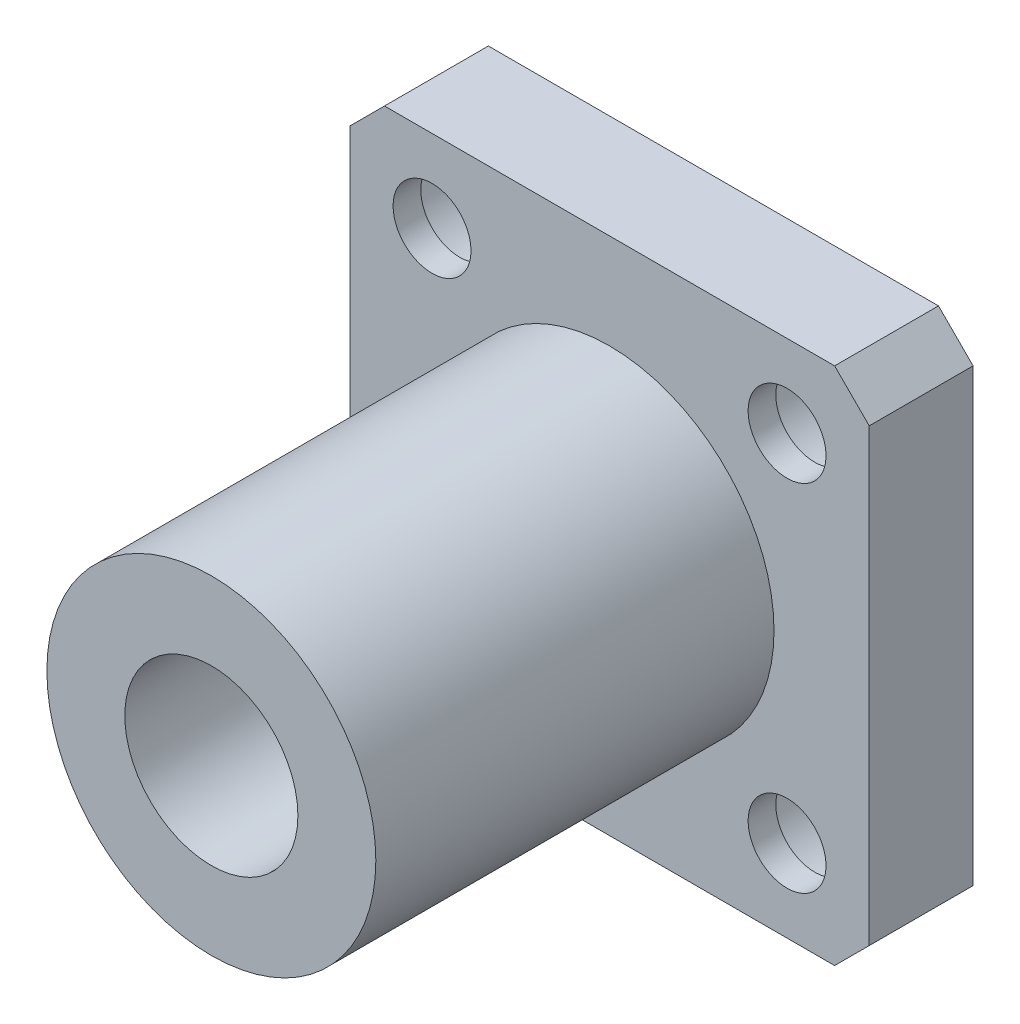
ISO-10303-21;
HEADER;
FILE_DESCRIPTION(('STEP AP214'),'2;1');
FILE_NAME('part.step','',(''),(''),'','','');
FILE_SCHEMA(('AUTOMOTIVE_DESIGN { 1 0 10303 214 1 1 1 1 }'));
ENDSEC;
DATA;
#1=APPLICATION_CONTEXT('core data for automotive mechanical design processes');
#2=APPLICATION_PROTOCOL_DEFINITION('international standard','automotive_design',2000,#1);
#3=PRODUCT_CONTEXT('',#1,'mechanical');
#4=PRODUCT('Part','Part','',(#3));
#5=PRODUCT_RELATED_PRODUCT_CATEGORY('part','',(#4));
#6=PRODUCT_DEFINITION_FORMATION('','',#4);
#7=PRODUCT_DEFINITION_CONTEXT('part definition',#1,'design');
#8=PRODUCT_DEFINITION('design','',#6,#7);
#9=PRODUCT_DEFINITION_SHAPE('','',#8);
#10=(LENGTH_UNIT() NAMED_UNIT(*) SI_UNIT(.MILLI.,.METRE.));
#11=(NAMED_UNIT(*) PLANE_ANGLE_UNIT() SI_UNIT($,.RADIAN.));
#12=(NAMED_UNIT(*) SI_UNIT($,.STERADIAN.) SOLID_ANGLE_UNIT());
#13=UNCERTAINTY_MEASURE_WITH_UNIT(LENGTH_MEASURE(1.E-05),#10,'distance_accuracy_value','');
#14=(GEOMETRIC_REPRESENTATION_CONTEXT(3) GLOBAL_UNCERTAINTY_ASSIGNED_CONTEXT((#13)) GLOBAL_UNIT_ASSIGNED_CONTEXT((#10,
#11,#12)) REPRESENTATION_CONTEXT('',''));
#15=CARTESIAN_POINT('',(0.,0.,0.));
#16=DIRECTION('',(0.,0.,1.));
#17=DIRECTION('',(1.,0.,0.));
#18=AXIS2_PLACEMENT_3D('',#15,#16,#17);
#19=CARTESIAN_POINT('',(0.,0.,6.));
#20=DIRECTION('',(1.,0.,0.));
#21=DIRECTION('',(0.,0.,-1.));
#22=AXIS2_PLACEMENT_3D('',#19,#20,#21);
#23=PLANE('',#22);
#24=DIRECTION('',(0.,-1.,0.));
#25=VECTOR('',#24,1.);
#26=CARTESIAN_POINT('',(0.,0.,6.));
#27=LINE('',#26,#25);
#28=CARTESIAN_POINT('',(0.,28.,6.));
#29=VERTEX_POINT('',#28);
#30=CARTESIAN_POINT('',(0.,2.00000000000001,6.));
#31=VERTEX_POINT('',#30);
#32=EDGE_CURVE('E121',#29,#31,#27,.T.);
#33=ORIENTED_EDGE('',*,*,#32,.F.);
#34=DIRECTION('',(0.,0.,-1.));
#35=VECTOR('',#34,1.);
#36=CARTESIAN_POINT('',(0.,28.,6.));
#37=LINE('',#36,#35);
#38=CARTESIAN_POINT('',(0.,28.,0.));
#39=VERTEX_POINT('',#38);
#40=EDGE_CURVE('E106',#29,#39,#37,.T.);
#41=ORIENTED_EDGE('',*,*,#40,.T.);
#42=DIRECTION('',(0.,-1.,0.));
#43=VECTOR('',#42,1.);
#44=CARTESIAN_POINT('',(0.,0.,0.));
#45=LINE('',#44,#43);
#46=CARTESIAN_POINT('',(0.,2.00000000000001,0.));
#47=VERTEX_POINT('',#46);
#48=EDGE_CURVE('E118',#39,#47,#45,.T.);
#49=ORIENTED_EDGE('',*,*,#48,.T.);
#50=DIRECTION('',(0.,0.,1.));
#51=VECTOR('',#50,1.);
#52=CARTESIAN_POINT('',(0.,2.00000000000001,6.));
#53=LINE('',#52,#51);
#54=EDGE_CURVE('E123',#47,#31,#53,.T.);
#55=ORIENTED_EDGE('',*,*,#54,.T.);
#56=EDGE_LOOP('',(#33,#41,#49,#55));
#57=FACE_BOUND('',#56,.T.);
#58=ADVANCED_FACE('F35',(#57),#23,.F.);
#59=CARTESIAN_POINT('',(0.,0.,6.));
#60=DIRECTION('',(0.,1.,0.));
#61=DIRECTION('',(0.,0.,1.));
#62=AXIS2_PLACEMENT_3D('',#59,#60,#61);
#63=PLANE('',#62);
#64=DIRECTION('',(1.,0.,0.));
#65=VECTOR('',#64,1.);
#66=CARTESIAN_POINT('',(0.,0.,0.));
#67=LINE('',#66,#65);
#68=CARTESIAN_POINT('',(2.,0.,0.));
#69=VERTEX_POINT('',#68);
#70=CARTESIAN_POINT('',(28.,0.,0.));
#71=VERTEX_POINT('',#70);
#72=EDGE_CURVE('E127',#69,#71,#67,.T.);
#73=ORIENTED_EDGE('',*,*,#72,.T.);
#74=DIRECTION('',(0.,0.,1.));
#75=VECTOR('',#74,1.);
#76=CARTESIAN_POINT('',(28.,0.,6.));
#77=LINE('',#76,#75);
#78=CARTESIAN_POINT('',(28.,0.,6.));
#79=VERTEX_POINT('',#78);
#80=EDGE_CURVE('E11',#71,#79,#77,.T.);
#81=ORIENTED_EDGE('',*,*,#80,.T.);
#82=DIRECTION('',(1.,0.,0.));
#83=VECTOR('',#82,1.);
#84=CARTESIAN_POINT('',(0.,0.,6.));
#85=LINE('',#84,#83);
#86=CARTESIAN_POINT('',(2.,0.,6.));
#87=VERTEX_POINT('',#86);
#88=EDGE_CURVE('E188',#87,#79,#85,.T.);
#89=ORIENTED_EDGE('',*,*,#88,.F.);
#90=DIRECTION('',(0.,0.,-1.));
#91=VECTOR('',#90,1.);
#92=CARTESIAN_POINT('',(2.,0.,6.));
#93=LINE('',#92,#91);
#94=EDGE_CURVE('E44',#87,#69,#93,.T.);
#95=ORIENTED_EDGE('',*,*,#94,.T.);
#96=EDGE_LOOP('',(#73,#81,#89,#95));
#97=FACE_BOUND('',#96,.T.);
#98=ADVANCED_FACE('F186',(#97),#63,.F.);
#99=CARTESIAN_POINT('',(30.,0.,6.));
#100=DIRECTION('',(-1.,0.,0.));
#101=DIRECTION('',(0.,0.,1.));
#102=AXIS2_PLACEMENT_3D('',#99,#100,#101);
#103=PLANE('',#102);
#104=DIRECTION('',(0.,1.,0.));
#105=VECTOR('',#104,1.);
#106=CARTESIAN_POINT('',(30.,0.,0.));
#107=LINE('',#106,#105);
#108=CARTESIAN_POINT('',(30.,2.,0.));
#109=VERTEX_POINT('',#108);
#110=CARTESIAN_POINT('',(30.,28.,0.));
#111=VERTEX_POINT('',#110);
#112=EDGE_CURVE('E131',#109,#111,#107,.T.);
#113=ORIENTED_EDGE('',*,*,#112,.T.);
#114=DIRECTION('',(0.,0.,1.));
#115=VECTOR('',#114,1.);
#116=CARTESIAN_POINT('',(30.,28.,6.));
#117=LINE('',#116,#115);
#118=CARTESIAN_POINT('',(30.,28.,6.));
#119=VERTEX_POINT('',#118);
#120=EDGE_CURVE('E51',#111,#119,#117,.T.);
#121=ORIENTED_EDGE('',*,*,#120,.T.);
#122=DIRECTION('',(0.,1.,0.));
#123=VECTOR('',#122,1.);
#124=CARTESIAN_POINT('',(30.,0.,6.));
#125=LINE('',#124,#123);
#126=CARTESIAN_POINT('',(30.,2.,6.));
#127=VERTEX_POINT('',#126);
#128=EDGE_CURVE('E196',#127,#119,#125,.T.);
#129=ORIENTED_EDGE('',*,*,#128,.F.);
#130=DIRECTION('',(0.,0.,-1.));
#131=VECTOR('',#130,1.);
#132=CARTESIAN_POINT('',(30.,2.,6.));
#133=LINE('',#132,#131);
#134=EDGE_CURVE('E179',#127,#109,#133,.T.);
#135=ORIENTED_EDGE('',*,*,#134,.T.);
#136=EDGE_LOOP('',(#113,#121,#129,#135));
#137=FACE_BOUND('',#136,.T.);
#138=ADVANCED_FACE('F195',(#137),#103,.F.);
#139=CARTESIAN_POINT('',(0.,30.,6.));
#140=DIRECTION('',(0.,-1.,0.));
#141=DIRECTION('',(0.,0.,-1.));
#142=AXIS2_PLACEMENT_3D('',#139,#140,#141);
#143=PLANE('',#142);
#144=DIRECTION('',(-1.,0.,0.));
#145=VECTOR('',#144,1.);
#146=CARTESIAN_POINT('',(0.,30.,0.));
#147=LINE('',#146,#145);
#148=CARTESIAN_POINT('',(28.,30.,0.));
#149=VERTEX_POINT('',#148);
#150=CARTESIAN_POINT('',(2.00000000000001,30.,0.));
#151=VERTEX_POINT('',#150);
#152=EDGE_CURVE('E141',#149,#151,#147,.T.);
#153=ORIENTED_EDGE('',*,*,#152,.T.);
#154=DIRECTION('',(0.,0.,1.));
#155=VECTOR('',#154,1.);
#156=CARTESIAN_POINT('',(2.00000000000001,30.,6.));
#157=LINE('',#156,#155);
#158=CARTESIAN_POINT('',(2.00000000000001,30.,6.));
#159=VERTEX_POINT('',#158);
#160=EDGE_CURVE('E107',#151,#159,#157,.T.);
#161=ORIENTED_EDGE('',*,*,#160,.T.);
#162=DIRECTION('',(-1.,0.,0.));
#163=VECTOR('',#162,1.);
#164=CARTESIAN_POINT('',(0.,30.,6.));
#165=LINE('',#164,#163);
#166=CARTESIAN_POINT('',(28.,30.,6.));
#167=VERTEX_POINT('',#166);
#168=EDGE_CURVE('E137',#167,#159,#165,.T.);
#169=ORIENTED_EDGE('',*,*,#168,.F.);
#170=DIRECTION('',(0.,0.,-1.));
#171=VECTOR('',#170,1.);
#172=CARTESIAN_POINT('',(28.,30.,6.));
#173=LINE('',#172,#171);
#174=EDGE_CURVE('E112',#167,#149,#173,.T.);
#175=ORIENTED_EDGE('',*,*,#174,.T.);
#176=EDGE_LOOP('',(#153,#161,#169,#175));
#177=FACE_BOUND('',#176,.T.);
#178=ADVANCED_FACE('F272',(#177),#143,.F.);
#179=CARTESIAN_POINT('',(0.,0.,6.));
#180=DIRECTION('',(0.,0.,-1.));
#181=DIRECTION('',(-1.,0.,0.));
#182=AXIS2_PLACEMENT_3D('',#179,#180,#181);
#183=PLANE('',#182);
#184=CARTESIAN_POINT('',(25.2530483272049,25.2530483272049,6.));
#185=DIRECTION('',(0.,0.,-1.));
#186=DIRECTION('',(-1.,0.,0.));
#187=AXIS2_PLACEMENT_3D('',#184,#185,#186);
#188=CIRCLE('',#187,2.25);
#189=CARTESIAN_POINT('',(23.0030483272049,25.2530483272049,6.));
#190=VERTEX_POINT('',#189);
#191=EDGE_CURVE('E158',#190,#190,#188,.T.);
#192=ORIENTED_EDGE('',*,*,#191,.T.);
#193=EDGE_LOOP('',(#192));
#194=FACE_BOUND('',#193,.T.);
#195=CARTESIAN_POINT('',(4.74695167279503,25.2530483272049,6.));
#196=DIRECTION('',(0.,0.,-1.));
#197=DIRECTION('',(-1.,0.,0.));
#198=AXIS2_PLACEMENT_3D('',#195,#196,#197);
#199=CIRCLE('',#198,2.25);
#200=CARTESIAN_POINT('',(2.49695167279503,25.2530483272049,6.));
#201=VERTEX_POINT('',#200);
#202=EDGE_CURVE('E153',#201,#201,#199,.T.);
#203=ORIENTED_EDGE('',*,*,#202,.T.);
#204=EDGE_LOOP('',(#203));
#205=FACE_BOUND('',#204,.T.);
#206=CARTESIAN_POINT('',(4.74695167279514,4.74695167279499,6.));
#207=DIRECTION('',(0.,0.,-1.));
#208=DIRECTION('',(-1.,0.,0.));
#209=AXIS2_PLACEMENT_3D('',#206,#207,#208);
#210=CIRCLE('',#209,2.25);
#211=CARTESIAN_POINT('',(2.49695167279514,4.74695167279499,6.));
#212=VERTEX_POINT('',#211);
#213=EDGE_CURVE('E148',#212,#212,#210,.T.);
#214=ORIENTED_EDGE('',*,*,#213,.T.);
#215=EDGE_LOOP('',(#214));
#216=FACE_BOUND('',#215,.T.);
#217=CARTESIAN_POINT('',(25.253048327205,4.74695167279517,6.));
#218=DIRECTION('',(0.,0.,-1.));
#219=DIRECTION('',(-1.,0.,0.));
#220=AXIS2_PLACEMENT_3D('',#217,#218,#219);
#221=CIRCLE('',#220,2.25);
#222=CARTESIAN_POINT('',(23.0030483272051,4.74695167279517,6.));
#223=VERTEX_POINT('',#222);
#224=EDGE_CURVE('E143',#223,#223,#221,.T.);
#225=ORIENTED_EDGE('',*,*,#224,.T.);
#226=EDGE_LOOP('',(#225));
#227=FACE_BOUND('',#226,.T.);
#228=CARTESIAN_POINT('',(15.,15.,6.));
#229=DIRECTION('',(0.,0.,1.));
#230=DIRECTION('',(1.,0.,0.));
#231=AXIS2_PLACEMENT_3D('',#228,#229,#230);
#232=CIRCLE('',#231,9.5);
#233=CARTESIAN_POINT('',(24.5,15.,6.));
#234=VERTEX_POINT('',#233);
#235=EDGE_CURVE('E163',#234,#234,#232,.T.);
#236=ORIENTED_EDGE('',*,*,#235,.F.);
#237=EDGE_LOOP('',(#236));
#238=FACE_BOUND('',#237,.T.);
#239=ORIENTED_EDGE('',*,*,#168,.T.);
#240=DIRECTION('',(0.707106781186549,0.707106781186546,0.));
#241=VECTOR('',#240,1.);
#242=CARTESIAN_POINT('',(0.,28.,6.));
#243=LINE('',#242,#241);
#244=EDGE_CURVE('E177',#159,#29,#243,.F.);
#245=ORIENTED_EDGE('',*,*,#244,.T.);
#246=ORIENTED_EDGE('',*,*,#32,.T.);
#247=DIRECTION('',(-0.707106781186546,0.707106781186549,0.));
#248=VECTOR('',#247,1.);
#249=CARTESIAN_POINT('',(2.,0.,6.));
#250=LINE('',#249,#248);
#251=EDGE_CURVE('E172',#31,#87,#250,.F.);
#252=ORIENTED_EDGE('',*,*,#251,.T.);
#253=ORIENTED_EDGE('',*,*,#88,.T.);
#254=DIRECTION('',(-0.707106781186549,-0.707106781186546,0.));
#255=VECTOR('',#254,1.);
#256=CARTESIAN_POINT('',(30.,2.,6.));
#257=LINE('',#256,#255);
#258=EDGE_CURVE('E58',#79,#127,#257,.F.);
#259=ORIENTED_EDGE('',*,*,#258,.T.);
#260=ORIENTED_EDGE('',*,*,#128,.T.);
#261=DIRECTION('',(0.707106781186546,-0.707106781186549,0.));
#262=VECTOR('',#261,1.);
#263=CARTESIAN_POINT('',(28.,30.,6.));
#264=LINE('',#263,#262);
#265=EDGE_CURVE('E175',#119,#167,#264,.F.);
#266=ORIENTED_EDGE('',*,*,#265,.T.);
#267=EDGE_LOOP('',(#239,#245,#246,#252,#253,#259,#260,#266));
#268=FACE_BOUND('',#267,.T.);
#269=ADVANCED_FACE('F243',(#194,#205,#216,#227,#238,#268),#183,.F.);
#270=CARTESIAN_POINT('',(0.,0.,0.));
#271=DIRECTION('',(0.,0.,-1.));
#272=DIRECTION('',(-1.,0.,0.));
#273=AXIS2_PLACEMENT_3D('',#270,#271,#272);
#274=PLANE('',#273);
#275=CARTESIAN_POINT('',(25.2530483272049,25.2530483272049,0.));
#276=DIRECTION('',(0.,0.,-1.));
#277=DIRECTION('',(-1.,0.,0.));
#278=AXIS2_PLACEMENT_3D('',#275,#276,#277);
#279=CIRCLE('',#278,4.);
#280=CARTESIAN_POINT('',(21.2530483272049,25.2530483272049,0.));
#281=VERTEX_POINT('',#280);
#282=EDGE_CURVE('E234',#281,#281,#279,.T.);
#283=ORIENTED_EDGE('',*,*,#282,.F.);
#284=EDGE_LOOP('',(#283));
#285=FACE_BOUND('',#284,.T.);
#286=CARTESIAN_POINT('',(4.74695167279503,25.2530483272049,0.));
#287=DIRECTION('',(0.,0.,-1.));
#288=DIRECTION('',(-1.,0.,0.));
#289=AXIS2_PLACEMENT_3D('',#286,#287,#288);
#290=CIRCLE('',#289,4.);
#291=CARTESIAN_POINT('',(0.746951672795032,25.2530483272049,0.));
#292=VERTEX_POINT('',#291);
#293=EDGE_CURVE('E161',#292,#292,#290,.T.);
#294=ORIENTED_EDGE('',*,*,#293,.F.);
#295=EDGE_LOOP('',(#294));
#296=FACE_BOUND('',#295,.T.);
#297=CARTESIAN_POINT('',(4.74695167279514,4.74695167279499,0.));
#298=DIRECTION('',(0.,0.,-1.));
#299=DIRECTION('',(-1.,0.,0.));
#300=AXIS2_PLACEMENT_3D('',#297,#298,#299);
#301=CIRCLE('',#300,4.);
#302=CARTESIAN_POINT('',(0.74695167279514,4.74695167279499,0.));
#303=VERTEX_POINT('',#302);
#304=EDGE_CURVE('E156',#303,#303,#301,.T.);
#305=ORIENTED_EDGE('',*,*,#304,.F.);
#306=EDGE_LOOP('',(#305));
#307=FACE_BOUND('',#306,.T.);
#308=CARTESIAN_POINT('',(25.253048327205,4.74695167279517,0.));
#309=DIRECTION('',(0.,0.,-1.));
#310=DIRECTION('',(-1.,0.,0.));
#311=AXIS2_PLACEMENT_3D('',#308,#309,#310);
#312=CIRCLE('',#311,4.);
#313=CARTESIAN_POINT('',(21.2530483272051,4.74695167279517,0.));
#314=VERTEX_POINT('',#313);
#315=EDGE_CURVE('E151',#314,#314,#312,.T.);
#316=ORIENTED_EDGE('',*,*,#315,.F.);
#317=EDGE_LOOP('',(#316));
#318=FACE_BOUND('',#317,.T.);
#319=CARTESIAN_POINT('',(15.,15.,0.));
#320=DIRECTION('',(0.,0.,1.));
#321=DIRECTION('',(1.,0.,0.));
#322=AXIS2_PLACEMENT_3D('',#319,#320,#321);
#323=CIRCLE('',#322,5.);
#324=CARTESIAN_POINT('',(20.,15.,0.));
#325=VERTEX_POINT('',#324);
#326=EDGE_CURVE('E134',#325,#325,#323,.T.);
#327=ORIENTED_EDGE('',*,*,#326,.T.);
#328=EDGE_LOOP('',(#327));
#329=FACE_BOUND('',#328,.T.);
#330=ORIENTED_EDGE('',*,*,#48,.F.);
#331=DIRECTION('',(-0.707106781186549,-0.707106781186546,0.));
#332=VECTOR('',#331,1.);
#333=CARTESIAN_POINT('',(-14.,14.,0.));
#334=LINE('',#333,#332);
#335=EDGE_CURVE('E102',#39,#151,#334,.F.);
#336=ORIENTED_EDGE('',*,*,#335,.T.);
#337=ORIENTED_EDGE('',*,*,#152,.F.);
#338=DIRECTION('',(-0.707106781186546,0.707106781186549,0.));
#339=VECTOR('',#338,1.);
#340=CARTESIAN_POINT('',(29.,28.9999999999999,0.));
#341=LINE('',#340,#339);
#342=EDGE_CURVE('E113',#149,#111,#341,.F.);
#343=ORIENTED_EDGE('',*,*,#342,.T.);
#344=ORIENTED_EDGE('',*,*,#112,.F.);
#345=DIRECTION('',(0.707106781186549,0.707106781186546,0.));
#346=VECTOR('',#345,1.);
#347=CARTESIAN_POINT('',(13.9999999999999,-14.,0.));
#348=LINE('',#347,#346);
#349=EDGE_CURVE('E166',#109,#71,#348,.F.);
#350=ORIENTED_EDGE('',*,*,#349,.T.);
#351=ORIENTED_EDGE('',*,*,#72,.F.);
#352=DIRECTION('',(0.707106781186546,-0.707106781186549,0.));
#353=VECTOR('',#352,1.);
#354=CARTESIAN_POINT('',(1.,1.,0.));
#355=LINE('',#354,#353);
#356=EDGE_CURVE('E122',#69,#47,#355,.F.);
#357=ORIENTED_EDGE('',*,*,#356,.T.);
#358=EDGE_LOOP('',(#330,#336,#337,#343,#344,#350,#351,#357));
#359=FACE_BOUND('',#358,.T.);
#360=ADVANCED_FACE('F125',(#285,#296,#307,#318,#329,#359),#274,.T.);
#361=CARTESIAN_POINT('',(15.,15.,29.));
#362=DIRECTION('',(0.,0.,-1.));
#363=DIRECTION('',(-1.,0.,0.));
#364=AXIS2_PLACEMENT_3D('',#361,#362,#363);
#365=CYLINDRICAL_SURFACE('',#364,9.5);
#366=CARTESIAN_POINT('',(15.,15.,29.));
#367=DIRECTION('',(0.,0.,1.));
#368=DIRECTION('',(1.,0.,0.));
#369=AXIS2_PLACEMENT_3D('',#366,#367,#368);
#370=CIRCLE('',#369,9.5);
#371=CARTESIAN_POINT('',(24.5,15.,29.));
#372=VERTEX_POINT('',#371);
#373=EDGE_CURVE('E128',#372,#372,#370,.T.);
#374=ORIENTED_EDGE('',*,*,#373,.F.);
#375=EDGE_LOOP('',(#374));
#376=FACE_BOUND('',#375,.T.);
#377=ORIENTED_EDGE('',*,*,#235,.T.);
#378=EDGE_LOOP('',(#377));
#379=FACE_BOUND('',#378,.T.);
#380=ADVANCED_FACE('F242',(#376,#379),#365,.T.);
#381=CARTESIAN_POINT('',(15.,15.,29.));
#382=DIRECTION('',(0.,0.,1.));
#383=DIRECTION('',(1.,0.,0.));
#384=AXIS2_PLACEMENT_3D('',#381,#382,#383);
#385=PLANE('',#384);
#386=CARTESIAN_POINT('',(15.,15.,29.));
#387=DIRECTION('',(0.,0.,1.));
#388=DIRECTION('',(1.,0.,0.));
#389=AXIS2_PLACEMENT_3D('',#386,#387,#388);
#390=CIRCLE('',#389,5.);
#391=CARTESIAN_POINT('',(20.,15.,29.));
#392=VERTEX_POINT('',#391);
#393=EDGE_CURVE('E146',#392,#392,#390,.T.);
#394=ORIENTED_EDGE('',*,*,#393,.F.);
#395=EDGE_LOOP('',(#394));
#396=FACE_BOUND('',#395,.T.);
#397=ORIENTED_EDGE('',*,*,#373,.T.);
#398=EDGE_LOOP('',(#397));
#399=FACE_BOUND('',#398,.T.);
#400=ADVANCED_FACE('F257',(#396,#399),#385,.T.);
#401=CARTESIAN_POINT('',(15.,15.,0.));
#402=DIRECTION('',(0.,0.,1.));
#403=DIRECTION('',(1.,0.,0.));
#404=AXIS2_PLACEMENT_3D('',#401,#402,#403);
#405=CYLINDRICAL_SURFACE('',#404,5.);
#406=ORIENTED_EDGE('',*,*,#326,.F.);
#407=EDGE_LOOP('',(#406));
#408=FACE_BOUND('',#407,.T.);
#409=ORIENTED_EDGE('',*,*,#393,.T.);
#410=EDGE_LOOP('',(#409));
#411=FACE_BOUND('',#410,.T.);
#412=ADVANCED_FACE('F253',(#408,#411),#405,.F.);
#413=CARTESIAN_POINT('',(25.253048327205,4.74695167279517,0.));
#414=DIRECTION('',(0.,0.,-1.));
#415=DIRECTION('',(-1.,0.,0.));
#416=AXIS2_PLACEMENT_3D('',#413,#414,#415);
#417=CYLINDRICAL_SURFACE('',#416,2.25);
#418=CARTESIAN_POINT('',(25.253048327205,4.74695167279517,4.4));
#419=DIRECTION('',(0.,0.,-1.));
#420=DIRECTION('',(-1.,0.,0.));
#421=AXIS2_PLACEMENT_3D('',#418,#419,#420);
#422=CIRCLE('',#421,2.25);
#423=CARTESIAN_POINT('',(23.003048327205,4.74695167279517,4.4));
#424=VERTEX_POINT('',#423);
#425=EDGE_CURVE('E147',#424,#424,#422,.T.);
#426=ORIENTED_EDGE('',*,*,#425,.T.);
#427=EDGE_LOOP('',(#426));
#428=FACE_BOUND('',#427,.T.);
#429=ORIENTED_EDGE('',*,*,#224,.F.);
#430=EDGE_LOOP('',(#429));
#431=FACE_BOUND('',#430,.T.);
#432=ADVANCED_FACE('F256',(#428,#431),#417,.F.);
#433=CARTESIAN_POINT('',(27.5030483272051,4.74695167279517,4.4));
#434=DIRECTION('',(0.,0.,1.));
#435=DIRECTION('',(1.,0.,0.));
#436=AXIS2_PLACEMENT_3D('',#433,#434,#435);
#437=PLANE('',#436);
#438=ORIENTED_EDGE('',*,*,#425,.F.);
#439=EDGE_LOOP('',(#438));
#440=FACE_BOUND('',#439,.T.);
#441=CARTESIAN_POINT('',(25.253048327205,4.74695167279517,4.4));
#442=DIRECTION('',(0.,0.,-1.));
#443=DIRECTION('',(-1.,0.,0.));
#444=AXIS2_PLACEMENT_3D('',#441,#442,#443);
#445=CIRCLE('',#444,4.);
#446=CARTESIAN_POINT('',(21.253048327205,4.74695167279517,4.4));
#447=VERTEX_POINT('',#446);
#448=EDGE_CURVE('E210',#447,#447,#445,.T.);
#449=ORIENTED_EDGE('',*,*,#448,.T.);
#450=EDGE_LOOP('',(#449));
#451=FACE_BOUND('',#450,.T.);
#452=ADVANCED_FACE('F311',(#440,#451),#437,.F.);
#453=CARTESIAN_POINT('',(25.253048327205,4.74695167279517,0.));
#454=DIRECTION('',(0.,0.,-1.));
#455=DIRECTION('',(-1.,0.,0.));
#456=AXIS2_PLACEMENT_3D('',#453,#454,#455);
#457=CYLINDRICAL_SURFACE('',#456,4.);
#458=ORIENTED_EDGE('',*,*,#448,.F.);
#459=EDGE_LOOP('',(#458));
#460=FACE_BOUND('',#459,.T.);
#461=ORIENTED_EDGE('',*,*,#315,.T.);
#462=EDGE_LOOP('',(#461));
#463=FACE_BOUND('',#462,.T.);
#464=ADVANCED_FACE('F315',(#460,#463),#457,.F.);
#465=CARTESIAN_POINT('',(4.74695167279514,4.74695167279499,0.));
#466=DIRECTION('',(0.,0.,-1.));
#467=DIRECTION('',(-1.,0.,0.));
#468=AXIS2_PLACEMENT_3D('',#465,#466,#467);
#469=CYLINDRICAL_SURFACE('',#468,2.25);
#470=CARTESIAN_POINT('',(4.74695167279514,4.74695167279499,4.4));
#471=DIRECTION('',(0.,0.,-1.));
#472=DIRECTION('',(-1.,0.,0.));
#473=AXIS2_PLACEMENT_3D('',#470,#471,#472);
#474=CIRCLE('',#473,2.25);
#475=CARTESIAN_POINT('',(2.49695167279514,4.74695167279499,4.4));
#476=VERTEX_POINT('',#475);
#477=EDGE_CURVE('E152',#476,#476,#474,.T.);
#478=ORIENTED_EDGE('',*,*,#477,.T.);
#479=EDGE_LOOP('',(#478));
#480=FACE_BOUND('',#479,.T.);
#481=ORIENTED_EDGE('',*,*,#213,.F.);
#482=EDGE_LOOP('',(#481));
#483=FACE_BOUND('',#482,.T.);
#484=ADVANCED_FACE('F319',(#480,#483),#469,.F.);
#485=CARTESIAN_POINT('',(6.99695167279514,4.74695167279499,4.4));
#486=DIRECTION('',(0.,0.,1.));
#487=DIRECTION('',(1.,0.,0.));
#488=AXIS2_PLACEMENT_3D('',#485,#486,#487);
#489=PLANE('',#488);
#490=ORIENTED_EDGE('',*,*,#477,.F.);
#491=EDGE_LOOP('',(#490));
#492=FACE_BOUND('',#491,.T.);
#493=CARTESIAN_POINT('',(4.74695167279514,4.74695167279499,4.4));
#494=DIRECTION('',(0.,0.,-1.));
#495=DIRECTION('',(-1.,0.,0.));
#496=AXIS2_PLACEMENT_3D('',#493,#494,#495);
#497=CIRCLE('',#496,4.);
#498=CARTESIAN_POINT('',(0.746951672795138,4.74695167279499,4.4));
#499=VERTEX_POINT('',#498);
#500=EDGE_CURVE('E217',#499,#499,#497,.T.);
#501=ORIENTED_EDGE('',*,*,#500,.T.);
#502=EDGE_LOOP('',(#501));
#503=FACE_BOUND('',#502,.T.);
#504=ADVANCED_FACE('F323',(#492,#503),#489,.F.);
#505=CARTESIAN_POINT('',(4.74695167279514,4.74695167279499,0.));
#506=DIRECTION('',(0.,0.,-1.));
#507=DIRECTION('',(-1.,0.,0.));
#508=AXIS2_PLACEMENT_3D('',#505,#506,#507);
#509=CYLINDRICAL_SURFACE('',#508,4.);
#510=ORIENTED_EDGE('',*,*,#500,.F.);
#511=EDGE_LOOP('',(#510));
#512=FACE_BOUND('',#511,.T.);
#513=ORIENTED_EDGE('',*,*,#304,.T.);
#514=EDGE_LOOP('',(#513));
#515=FACE_BOUND('',#514,.T.);
#516=ADVANCED_FACE('F327',(#512,#515),#509,.F.);
#517=CARTESIAN_POINT('',(4.74695167279503,25.2530483272049,0.));
#518=DIRECTION('',(0.,0.,-1.));
#519=DIRECTION('',(-1.,0.,0.));
#520=AXIS2_PLACEMENT_3D('',#517,#518,#519);
#521=CYLINDRICAL_SURFACE('',#520,2.25);
#522=CARTESIAN_POINT('',(4.74695167279503,25.2530483272049,4.4));
#523=DIRECTION('',(0.,0.,-1.));
#524=DIRECTION('',(-1.,0.,0.));
#525=AXIS2_PLACEMENT_3D('',#522,#523,#524);
#526=CIRCLE('',#525,2.25);
#527=CARTESIAN_POINT('',(2.49695167279503,25.2530483272049,4.4));
#528=VERTEX_POINT('',#527);
#529=EDGE_CURVE('E157',#528,#528,#526,.T.);
#530=ORIENTED_EDGE('',*,*,#529,.T.);
#531=EDGE_LOOP('',(#530));
#532=FACE_BOUND('',#531,.T.);
#533=ORIENTED_EDGE('',*,*,#202,.F.);
#534=EDGE_LOOP('',(#533));
#535=FACE_BOUND('',#534,.T.);
#536=ADVANCED_FACE('F331',(#532,#535),#521,.F.);
#537=CARTESIAN_POINT('',(6.99695167279503,25.2530483272049,4.4));
#538=DIRECTION('',(0.,0.,1.));
#539=DIRECTION('',(1.,0.,0.));
#540=AXIS2_PLACEMENT_3D('',#537,#538,#539);
#541=PLANE('',#540);
#542=ORIENTED_EDGE('',*,*,#529,.F.);
#543=EDGE_LOOP('',(#542));
#544=FACE_BOUND('',#543,.T.);
#545=CARTESIAN_POINT('',(4.74695167279503,25.2530483272049,4.4));
#546=DIRECTION('',(0.,0.,-1.));
#547=DIRECTION('',(-1.,0.,0.));
#548=AXIS2_PLACEMENT_3D('',#545,#546,#547);
#549=CIRCLE('',#548,4.);
#550=CARTESIAN_POINT('',(0.746951672795031,25.2530483272049,4.4));
#551=VERTEX_POINT('',#550);
#552=EDGE_CURVE('E224',#551,#551,#549,.T.);
#553=ORIENTED_EDGE('',*,*,#552,.T.);
#554=EDGE_LOOP('',(#553));
#555=FACE_BOUND('',#554,.T.);
#556=ADVANCED_FACE('F335',(#544,#555),#541,.F.);
#557=CARTESIAN_POINT('',(4.74695167279503,25.2530483272049,0.));
#558=DIRECTION('',(0.,0.,-1.));
#559=DIRECTION('',(-1.,0.,0.));
#560=AXIS2_PLACEMENT_3D('',#557,#558,#559);
#561=CYLINDRICAL_SURFACE('',#560,4.);
#562=ORIENTED_EDGE('',*,*,#552,.F.);
#563=EDGE_LOOP('',(#562));
#564=FACE_BOUND('',#563,.T.);
#565=ORIENTED_EDGE('',*,*,#293,.T.);
#566=EDGE_LOOP('',(#565));
#567=FACE_BOUND('',#566,.T.);
#568=ADVANCED_FACE('F339',(#564,#567),#561,.F.);
#569=CARTESIAN_POINT('',(25.2530483272049,25.2530483272049,0.));
#570=DIRECTION('',(0.,0.,-1.));
#571=DIRECTION('',(-1.,0.,0.));
#572=AXIS2_PLACEMENT_3D('',#569,#570,#571);
#573=CYLINDRICAL_SURFACE('',#572,2.25);
#574=CARTESIAN_POINT('',(25.2530483272049,25.2530483272049,4.4));
#575=DIRECTION('',(0.,0.,-1.));
#576=DIRECTION('',(-1.,0.,0.));
#577=AXIS2_PLACEMENT_3D('',#574,#575,#576);
#578=CIRCLE('',#577,2.25);
#579=CARTESIAN_POINT('',(23.0030483272049,25.2530483272049,4.4));
#580=VERTEX_POINT('',#579);
#581=EDGE_CURVE('E162',#580,#580,#578,.T.);
#582=ORIENTED_EDGE('',*,*,#581,.T.);
#583=EDGE_LOOP('',(#582));
#584=FACE_BOUND('',#583,.T.);
#585=ORIENTED_EDGE('',*,*,#191,.F.);
#586=EDGE_LOOP('',(#585));
#587=FACE_BOUND('',#586,.T.);
#588=ADVANCED_FACE('F343',(#584,#587),#573,.F.);
#589=CARTESIAN_POINT('',(27.5030483272049,25.2530483272049,4.4));
#590=DIRECTION('',(0.,0.,1.));
#591=DIRECTION('',(1.,0.,0.));
#592=AXIS2_PLACEMENT_3D('',#589,#590,#591);
#593=PLANE('',#592);
#594=ORIENTED_EDGE('',*,*,#581,.F.);
#595=EDGE_LOOP('',(#594));
#596=FACE_BOUND('',#595,.T.);
#597=CARTESIAN_POINT('',(25.2530483272049,25.2530483272049,4.4));
#598=DIRECTION('',(0.,0.,-1.));
#599=DIRECTION('',(-1.,0.,0.));
#600=AXIS2_PLACEMENT_3D('',#597,#598,#599);
#601=CIRCLE('',#600,4.);
#602=CARTESIAN_POINT('',(21.2530483272049,25.2530483272049,4.4));
#603=VERTEX_POINT('',#602);
#604=EDGE_CURVE('E231',#603,#603,#601,.T.);
#605=ORIENTED_EDGE('',*,*,#604,.T.);
#606=EDGE_LOOP('',(#605));
#607=FACE_BOUND('',#606,.T.);
#608=ADVANCED_FACE('F347',(#596,#607),#593,.F.);
#609=CARTESIAN_POINT('',(25.2530483272049,25.2530483272049,0.));
#610=DIRECTION('',(0.,0.,-1.));
#611=DIRECTION('',(-1.,0.,0.));
#612=AXIS2_PLACEMENT_3D('',#609,#610,#611);
#613=CYLINDRICAL_SURFACE('',#612,4.);
#614=ORIENTED_EDGE('',*,*,#604,.F.);
#615=EDGE_LOOP('',(#614));
#616=FACE_BOUND('',#615,.T.);
#617=ORIENTED_EDGE('',*,*,#282,.T.);
#618=EDGE_LOOP('',(#617));
#619=FACE_BOUND('',#618,.T.);
#620=ADVANCED_FACE('F238',(#616,#619),#613,.F.);
#621=CARTESIAN_POINT('',(0.,28.,6.));
#622=DIRECTION('',(0.707106781186546,-0.707106781186549,0.));
#623=DIRECTION('',(0.,0.,-1.));
#624=AXIS2_PLACEMENT_3D('',#621,#622,#623);
#625=PLANE('',#624);
#626=ORIENTED_EDGE('',*,*,#244,.F.);
#627=ORIENTED_EDGE('',*,*,#160,.F.);
#628=ORIENTED_EDGE('',*,*,#335,.F.);
#629=ORIENTED_EDGE('',*,*,#40,.F.);
#630=EDGE_LOOP('',(#626,#627,#628,#629));
#631=FACE_BOUND('',#630,.T.);
#632=ADVANCED_FACE('F105',(#631),#625,.F.);
#633=CARTESIAN_POINT('',(28.,30.,6.));
#634=DIRECTION('',(-0.707106781186549,-0.707106781186546,0.));
#635=DIRECTION('',(0.,0.,-1.));
#636=AXIS2_PLACEMENT_3D('',#633,#634,#635);
#637=PLANE('',#636);
#638=ORIENTED_EDGE('',*,*,#265,.F.);
#639=ORIENTED_EDGE('',*,*,#120,.F.);
#640=ORIENTED_EDGE('',*,*,#342,.F.);
#641=ORIENTED_EDGE('',*,*,#174,.F.);
#642=EDGE_LOOP('',(#638,#639,#640,#641));
#643=FACE_BOUND('',#642,.T.);
#644=ADVANCED_FACE('F279',(#643),#637,.F.);
#645=CARTESIAN_POINT('',(30.,2.,6.));
#646=DIRECTION('',(-0.707106781186546,0.707106781186549,0.));
#647=DIRECTION('',(0.,0.,-1.));
#648=AXIS2_PLACEMENT_3D('',#645,#646,#647);
#649=PLANE('',#648);
#650=ORIENTED_EDGE('',*,*,#258,.F.);
#651=ORIENTED_EDGE('',*,*,#80,.F.);
#652=ORIENTED_EDGE('',*,*,#349,.F.);
#653=ORIENTED_EDGE('',*,*,#134,.F.);
#654=EDGE_LOOP('',(#650,#651,#652,#653));
#655=FACE_BOUND('',#654,.T.);
#656=ADVANCED_FACE('F194',(#655),#649,.F.);
#657=CARTESIAN_POINT('',(2.,0.,6.));
#658=DIRECTION('',(0.707106781186549,0.707106781186546,0.));
#659=DIRECTION('',(0.,0.,-1.));
#660=AXIS2_PLACEMENT_3D('',#657,#658,#659);
#661=PLANE('',#660);
#662=ORIENTED_EDGE('',*,*,#251,.F.);
#663=ORIENTED_EDGE('',*,*,#54,.F.);
#664=ORIENTED_EDGE('',*,*,#356,.F.);
#665=ORIENTED_EDGE('',*,*,#94,.F.);
#666=EDGE_LOOP('',(#662,#663,#664,#665));
#667=FACE_BOUND('',#666,.T.);
#668=ADVANCED_FACE('F38',(#667),#661,.F.);
#669=CLOSED_SHELL('',(#58,#98,#138,#178,#269,#360,#380,#400,#412,#432,#452,#464,#484,#504,#516,
#536,#556,#568,#588,#608,#620,#632,#644,#656,#668));
#670=MANIFOLD_SOLID_BREP('B2',#669);
#671=ADVANCED_BREP_SHAPE_REPRESENTATION('',(#18,#670),#14);
#672=SHAPE_DEFINITION_REPRESENTATION(#9,#671);
ENDSEC;
END-ISO-10303-21;
